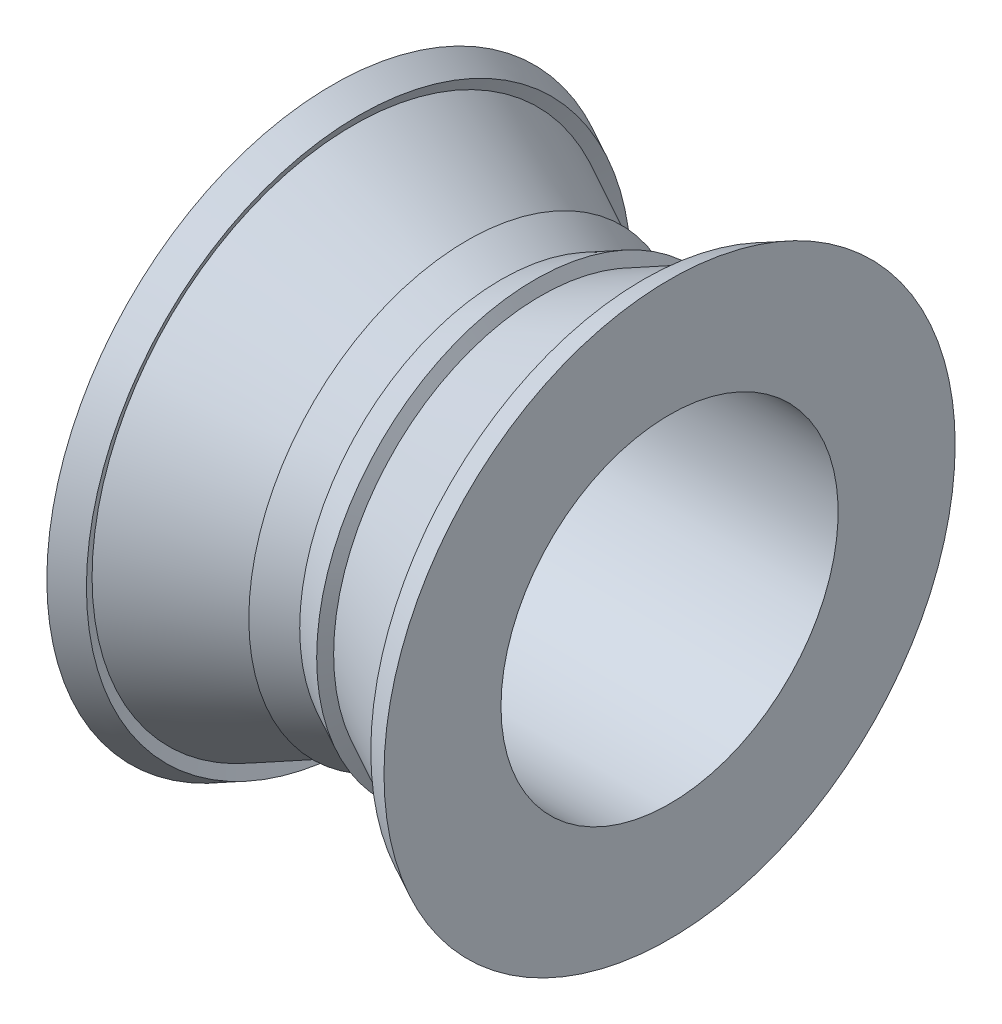
ISO-10303-21;
HEADER;
FILE_DESCRIPTION(('STEP AP214'),'2;1');
FILE_NAME('part.step','',(''),(''),'','','');
FILE_SCHEMA(('AUTOMOTIVE_DESIGN { 1 0 10303 214 1 1 1 1 }'));
ENDSEC;
DATA;
#1=APPLICATION_CONTEXT('core data for automotive mechanical design processes');
#2=APPLICATION_PROTOCOL_DEFINITION('international standard','automotive_design',2000,#1);
#3=PRODUCT_CONTEXT('',#1,'mechanical');
#4=PRODUCT('Part','Part','',(#3));
#5=PRODUCT_RELATED_PRODUCT_CATEGORY('part','',(#4));
#6=PRODUCT_DEFINITION_FORMATION('','',#4);
#7=PRODUCT_DEFINITION_CONTEXT('part definition',#1,'design');
#8=PRODUCT_DEFINITION('design','',#6,#7);
#9=PRODUCT_DEFINITION_SHAPE('','',#8);
#10=(LENGTH_UNIT() NAMED_UNIT(*) SI_UNIT(.MILLI.,.METRE.));
#11=(NAMED_UNIT(*) PLANE_ANGLE_UNIT() SI_UNIT($,.RADIAN.));
#12=(NAMED_UNIT(*) SI_UNIT($,.STERADIAN.) SOLID_ANGLE_UNIT());
#13=UNCERTAINTY_MEASURE_WITH_UNIT(LENGTH_MEASURE(1.E-05),#10,'distance_accuracy_value','');
#14=(GEOMETRIC_REPRESENTATION_CONTEXT(3) GLOBAL_UNCERTAINTY_ASSIGNED_CONTEXT((#13)) GLOBAL_UNIT_ASSIGNED_CONTEXT((#10,
#11,#12)) REPRESENTATION_CONTEXT('',''));
#15=CARTESIAN_POINT('',(0.,0.,0.));
#16=DIRECTION('',(0.,0.,1.));
#17=DIRECTION('',(1.,0.,0.));
#18=AXIS2_PLACEMENT_3D('',#15,#16,#17);
#19=CARTESIAN_POINT('',(40.,40.,0.));
#20=DIRECTION('',(1.,0.,0.));
#21=DIRECTION('',(0.,0.,-1.));
#22=AXIS2_PLACEMENT_3D('',#19,#20,#21);
#23=PLANE('',#22);
#24=CARTESIAN_POINT('',(40.,60.,0.));
#25=DIRECTION('',(-1.,0.,0.));
#26=DIRECTION('',(0.,0.,1.));
#27=AXIS2_PLACEMENT_3D('',#24,#25,#26);
#28=CIRCLE('',#27,20.);
#29=CARTESIAN_POINT('',(40.,60.,20.));
#30=VERTEX_POINT('',#29);
#31=EDGE_CURVE('E79',#30,#30,#28,.T.);
#32=ORIENTED_EDGE('',*,*,#31,.T.);
#33=EDGE_LOOP('',(#32));
#34=FACE_BOUND('',#33,.T.);
#35=CARTESIAN_POINT('',(40.,60.,0.));
#36=DIRECTION('',(-1.,0.,0.));
#37=DIRECTION('',(0.,0.,1.));
#38=AXIS2_PLACEMENT_3D('',#35,#36,#37);
#39=CIRCLE('',#38,33.8819660112501);
#40=CARTESIAN_POINT('',(40.,60.,33.8819660112501));
#41=VERTEX_POINT('',#40);
#42=EDGE_CURVE('E10',#41,#41,#39,.T.);
#43=ORIENTED_EDGE('',*,*,#42,.F.);
#44=EDGE_LOOP('',(#43));
#45=FACE_BOUND('',#44,.T.);
#46=ADVANCED_FACE('F36',(#34,#45),#23,.T.);
#47=CARTESIAN_POINT('',(36.8695048315003,60.,0.));
#48=DIRECTION('',(1.,0.,0.));
#49=DIRECTION('',(0.,0.,-1.));
#50=AXIS2_PLACEMENT_3D('',#47,#48,#49);
#51=CONICAL_SURFACE('',#50,32.3167184270002,0.46364760900081);
#52=ORIENTED_EDGE('',*,*,#42,.T.);
#53=EDGE_LOOP('',(#52));
#54=FACE_BOUND('',#53,.T.);
#55=CARTESIAN_POINT('',(36.8695048315003,60.,0.));
#56=DIRECTION('',(-1.,0.,0.));
#57=DIRECTION('',(0.,0.,1.));
#58=AXIS2_PLACEMENT_3D('',#55,#56,#57);
#59=CIRCLE('',#58,32.3167184270002);
#60=CARTESIAN_POINT('',(36.8695048315003,60.,32.3167184270002));
#61=VERTEX_POINT('',#60);
#62=EDGE_CURVE('E42',#61,#61,#59,.T.);
#63=ORIENTED_EDGE('',*,*,#62,.F.);
#64=EDGE_LOOP('',(#63));
#65=FACE_BOUND('',#64,.T.);
#66=ADVANCED_FACE('F97',(#54,#65),#51,.T.);
#67=CARTESIAN_POINT('',(37.5403252247503,60.,0.));
#68=DIRECTION('',(-1.,0.,0.));
#69=DIRECTION('',(0.,0.,1.));
#70=AXIS2_PLACEMENT_3D('',#67,#68,#69);
#71=CONICAL_SURFACE('',#70,30.9750776405004,1.10714871779409);
#72=ORIENTED_EDGE('',*,*,#62,.T.);
#73=EDGE_LOOP('',(#72));
#74=FACE_BOUND('',#73,.T.);
#75=CARTESIAN_POINT('',(37.5403252247503,60.,0.));
#76=DIRECTION('',(-1.,0.,0.));
#77=DIRECTION('',(0.,0.,1.));
#78=AXIS2_PLACEMENT_3D('',#75,#76,#77);
#79=CIRCLE('',#78,30.9750776405004);
#80=CARTESIAN_POINT('',(37.5403252247503,60.,30.9750776405004));
#81=VERTEX_POINT('',#80);
#82=EDGE_CURVE('E46',#81,#81,#79,.T.);
#83=ORIENTED_EDGE('',*,*,#82,.F.);
#84=EDGE_LOOP('',(#83));
#85=FACE_BOUND('',#84,.T.);
#86=ADVANCED_FACE('F101',(#74,#85),#71,.F.);
#87=CARTESIAN_POINT('',(24.6957427527496,60.,0.));
#88=DIRECTION('',(1.,0.,0.));
#89=DIRECTION('',(0.,0.,-1.));
#90=AXIS2_PLACEMENT_3D('',#87,#88,#89);
#91=CONICAL_SURFACE('',#90,24.5527864045,0.463647609000804);
#92=ORIENTED_EDGE('',*,*,#82,.T.);
#93=EDGE_LOOP('',(#92));
#94=FACE_BOUND('',#93,.T.);
#95=CARTESIAN_POINT('',(24.6957427527496,60.,0.));
#96=DIRECTION('',(-1.,0.,0.));
#97=DIRECTION('',(0.,0.,1.));
#98=AXIS2_PLACEMENT_3D('',#95,#96,#97);
#99=CIRCLE('',#98,24.5527864045);
#100=CARTESIAN_POINT('',(24.6957427527496,60.,24.5527864045));
#101=VERTEX_POINT('',#100);
#102=EDGE_CURVE('E50',#101,#101,#99,.T.);
#103=ORIENTED_EDGE('',*,*,#102,.F.);
#104=EDGE_LOOP('',(#103));
#105=FACE_BOUND('',#104,.T.);
#106=ADVANCED_FACE('F105',(#94,#105),#91,.T.);
#107=CARTESIAN_POINT('',(24.0249223594996,60.,0.));
#108=DIRECTION('',(-1.,0.,0.));
#109=DIRECTION('',(0.,0.,1.));
#110=AXIS2_PLACEMENT_3D('',#107,#108,#109);
#111=CONICAL_SURFACE('',#110,25.8944271909999,1.10714871779409);
#112=ORIENTED_EDGE('',*,*,#102,.T.);
#113=EDGE_LOOP('',(#112));
#114=FACE_BOUND('',#113,.T.);
#115=CARTESIAN_POINT('',(24.0249223594996,60.,0.));
#116=DIRECTION('',(-1.,0.,0.));
#117=DIRECTION('',(0.,0.,1.));
#118=AXIS2_PLACEMENT_3D('',#115,#116,#117);
#119=CIRCLE('',#118,25.8944271909999);
#120=CARTESIAN_POINT('',(24.0249223594996,60.,25.8944271909999));
#121=VERTEX_POINT('',#120);
#122=EDGE_CURVE('E55',#121,#121,#119,.T.);
#123=ORIENTED_EDGE('',*,*,#122,.F.);
#124=EDGE_LOOP('',(#123));
#125=FACE_BOUND('',#124,.T.);
#126=ADVANCED_FACE('F111',(#114,#125),#111,.T.);
#127=CARTESIAN_POINT('',(20.,60.,0.));
#128=DIRECTION('',(1.,0.,0.));
#129=DIRECTION('',(0.,0.,-1.));
#130=AXIS2_PLACEMENT_3D('',#127,#128,#129);
#131=CONICAL_SURFACE('',#130,23.8819660112501,0.463647609000805);
#132=ORIENTED_EDGE('',*,*,#122,.T.);
#133=EDGE_LOOP('',(#132));
#134=FACE_BOUND('',#133,.T.);
#135=CARTESIAN_POINT('',(20.,60.,0.));
#136=DIRECTION('',(-1.,0.,0.));
#137=DIRECTION('',(0.,0.,1.));
#138=AXIS2_PLACEMENT_3D('',#135,#136,#137);
#139=CIRCLE('',#138,23.8819660112501);
#140=CARTESIAN_POINT('',(20.,60.,23.8819660112501));
#141=VERTEX_POINT('',#140);
#142=EDGE_CURVE('E58',#141,#141,#139,.T.);
#143=ORIENTED_EDGE('',*,*,#142,.F.);
#144=EDGE_LOOP('',(#143));
#145=FACE_BOUND('',#144,.T.);
#146=ADVANCED_FACE('F115',(#134,#145),#131,.T.);
#147=CARTESIAN_POINT('',(15.9750776405004,60.,0.));
#148=DIRECTION('',(-1.,0.,0.));
#149=DIRECTION('',(0.,0.,1.));
#150=AXIS2_PLACEMENT_3D('',#147,#148,#149);
#151=CONICAL_SURFACE('',#150,25.8944271909999,0.463647609000809);
#152=ORIENTED_EDGE('',*,*,#142,.T.);
#153=EDGE_LOOP('',(#152));
#154=FACE_BOUND('',#153,.T.);
#155=CARTESIAN_POINT('',(15.9750776405004,60.,0.));
#156=DIRECTION('',(-1.,0.,0.));
#157=DIRECTION('',(0.,0.,1.));
#158=AXIS2_PLACEMENT_3D('',#155,#156,#157);
#159=CIRCLE('',#158,25.8944271909999);
#160=CARTESIAN_POINT('',(15.9750776405004,60.,25.8944271909999));
#161=VERTEX_POINT('',#160);
#162=EDGE_CURVE('E61',#161,#161,#159,.T.);
#163=ORIENTED_EDGE('',*,*,#162,.F.);
#164=EDGE_LOOP('',(#163));
#165=FACE_BOUND('',#164,.T.);
#166=ADVANCED_FACE('F119',(#154,#165),#151,.T.);
#167=CARTESIAN_POINT('',(15.3042572472504,60.,0.));
#168=DIRECTION('',(1.,0.,0.));
#169=DIRECTION('',(0.,0.,-1.));
#170=AXIS2_PLACEMENT_3D('',#167,#168,#169);
#171=CONICAL_SURFACE('',#170,24.5527864045,1.10714871779409);
#172=ORIENTED_EDGE('',*,*,#162,.T.);
#173=EDGE_LOOP('',(#172));
#174=FACE_BOUND('',#173,.T.);
#175=CARTESIAN_POINT('',(15.3042572472504,60.,0.));
#176=DIRECTION('',(-1.,0.,0.));
#177=DIRECTION('',(0.,0.,1.));
#178=AXIS2_PLACEMENT_3D('',#175,#176,#177);
#179=CIRCLE('',#178,24.5527864045);
#180=CARTESIAN_POINT('',(15.3042572472504,60.,24.5527864045));
#181=VERTEX_POINT('',#180);
#182=EDGE_CURVE('E64',#181,#181,#179,.T.);
#183=ORIENTED_EDGE('',*,*,#182,.F.);
#184=EDGE_LOOP('',(#183));
#185=FACE_BOUND('',#184,.T.);
#186=ADVANCED_FACE('F123',(#174,#185),#171,.T.);
#187=CARTESIAN_POINT('',(2.45967477524976,60.,0.));
#188=DIRECTION('',(-1.,0.,0.));
#189=DIRECTION('',(0.,0.,1.));
#190=AXIS2_PLACEMENT_3D('',#187,#188,#189);
#191=CONICAL_SURFACE('',#190,30.9750776405004,0.463647609000806);
#192=ORIENTED_EDGE('',*,*,#182,.T.);
#193=EDGE_LOOP('',(#192));
#194=FACE_BOUND('',#193,.T.);
#195=CARTESIAN_POINT('',(2.45967477524976,60.,0.));
#196=DIRECTION('',(-1.,0.,0.));
#197=DIRECTION('',(0.,0.,1.));
#198=AXIS2_PLACEMENT_3D('',#195,#196,#197);
#199=CIRCLE('',#198,30.9750776405004);
#200=CARTESIAN_POINT('',(2.45967477524976,60.,30.9750776405004));
#201=VERTEX_POINT('',#200);
#202=EDGE_CURVE('E67',#201,#201,#199,.T.);
#203=ORIENTED_EDGE('',*,*,#202,.F.);
#204=EDGE_LOOP('',(#203));
#205=FACE_BOUND('',#204,.T.);
#206=ADVANCED_FACE('F127',(#194,#205),#191,.T.);
#207=CARTESIAN_POINT('',(3.1304951684997,60.,0.));
#208=DIRECTION('',(1.,0.,0.));
#209=DIRECTION('',(0.,0.,-1.));
#210=AXIS2_PLACEMENT_3D('',#207,#208,#209);
#211=CONICAL_SURFACE('',#210,32.3167184270002,1.10714871779409);
#212=ORIENTED_EDGE('',*,*,#202,.T.);
#213=EDGE_LOOP('',(#212));
#214=FACE_BOUND('',#213,.T.);
#215=CARTESIAN_POINT('',(3.1304951684997,60.,0.));
#216=DIRECTION('',(-1.,0.,0.));
#217=DIRECTION('',(0.,0.,1.));
#218=AXIS2_PLACEMENT_3D('',#215,#216,#217);
#219=CIRCLE('',#218,32.3167184270002);
#220=CARTESIAN_POINT('',(3.1304951684997,60.,32.3167184270002));
#221=VERTEX_POINT('',#220);
#222=EDGE_CURVE('E70',#221,#221,#219,.T.);
#223=ORIENTED_EDGE('',*,*,#222,.F.);
#224=EDGE_LOOP('',(#223));
#225=FACE_BOUND('',#224,.T.);
#226=ADVANCED_FACE('F131',(#214,#225),#211,.F.);
#227=CARTESIAN_POINT('',(0.,60.,0.));
#228=DIRECTION('',(-1.,0.,0.));
#229=DIRECTION('',(0.,0.,1.));
#230=AXIS2_PLACEMENT_3D('',#227,#228,#229);
#231=CONICAL_SURFACE('',#230,33.8819660112501,0.463647609000808);
#232=ORIENTED_EDGE('',*,*,#222,.T.);
#233=EDGE_LOOP('',(#232));
#234=FACE_BOUND('',#233,.T.);
#235=CARTESIAN_POINT('',(0.,60.,0.));
#236=DIRECTION('',(-1.,0.,0.));
#237=DIRECTION('',(0.,0.,1.));
#238=AXIS2_PLACEMENT_3D('',#235,#236,#237);
#239=CIRCLE('',#238,33.8819660112501);
#240=CARTESIAN_POINT('',(0.,60.,33.8819660112501));
#241=VERTEX_POINT('',#240);
#242=EDGE_CURVE('E73',#241,#241,#239,.T.);
#243=ORIENTED_EDGE('',*,*,#242,.F.);
#244=EDGE_LOOP('',(#243));
#245=FACE_BOUND('',#244,.T.);
#246=ADVANCED_FACE('F93',(#234,#245),#231,.T.);
#247=CARTESIAN_POINT('',(0.,40.,0.));
#248=DIRECTION('',(-1.,0.,0.));
#249=DIRECTION('',(0.,0.,1.));
#250=AXIS2_PLACEMENT_3D('',#247,#248,#249);
#251=PLANE('',#250);
#252=ORIENTED_EDGE('',*,*,#242,.T.);
#253=EDGE_LOOP('',(#252));
#254=FACE_BOUND('',#253,.T.);
#255=CARTESIAN_POINT('',(0.,60.,0.));
#256=DIRECTION('',(-1.,0.,0.));
#257=DIRECTION('',(0.,0.,1.));
#258=AXIS2_PLACEMENT_3D('',#255,#256,#257);
#259=CIRCLE('',#258,20.);
#260=CARTESIAN_POINT('',(0.,60.,20.));
#261=VERTEX_POINT('',#260);
#262=EDGE_CURVE('E76',#261,#261,#259,.T.);
#263=ORIENTED_EDGE('',*,*,#262,.F.);
#264=EDGE_LOOP('',(#263));
#265=FACE_BOUND('',#264,.T.);
#266=ADVANCED_FACE('F87',(#254,#265),#251,.T.);
#267=CARTESIAN_POINT('',(-8.89283128343716,60.,0.));
#268=DIRECTION('',(-1.,0.,0.));
#269=DIRECTION('',(0.,0.,1.));
#270=AXIS2_PLACEMENT_3D('',#267,#268,#269);
#271=CYLINDRICAL_SURFACE('',#270,20.);
#272=ORIENTED_EDGE('',*,*,#262,.T.);
#273=EDGE_LOOP('',(#272));
#274=FACE_BOUND('',#273,.T.);
#275=ORIENTED_EDGE('',*,*,#31,.F.);
#276=EDGE_LOOP('',(#275));
#277=FACE_BOUND('',#276,.T.);
#278=ADVANCED_FACE('F85',(#274,#277),#271,.F.);
#279=CLOSED_SHELL('',(#46,#66,#86,#106,#126,#146,#166,#186,#206,#226,#246,#266,#278));
#280=MANIFOLD_SOLID_BREP('B2',#279);
#281=ADVANCED_BREP_SHAPE_REPRESENTATION('',(#18,#280),#14);
#282=SHAPE_DEFINITION_REPRESENTATION(#9,#281);
ENDSEC;
END-ISO-10303-21;
